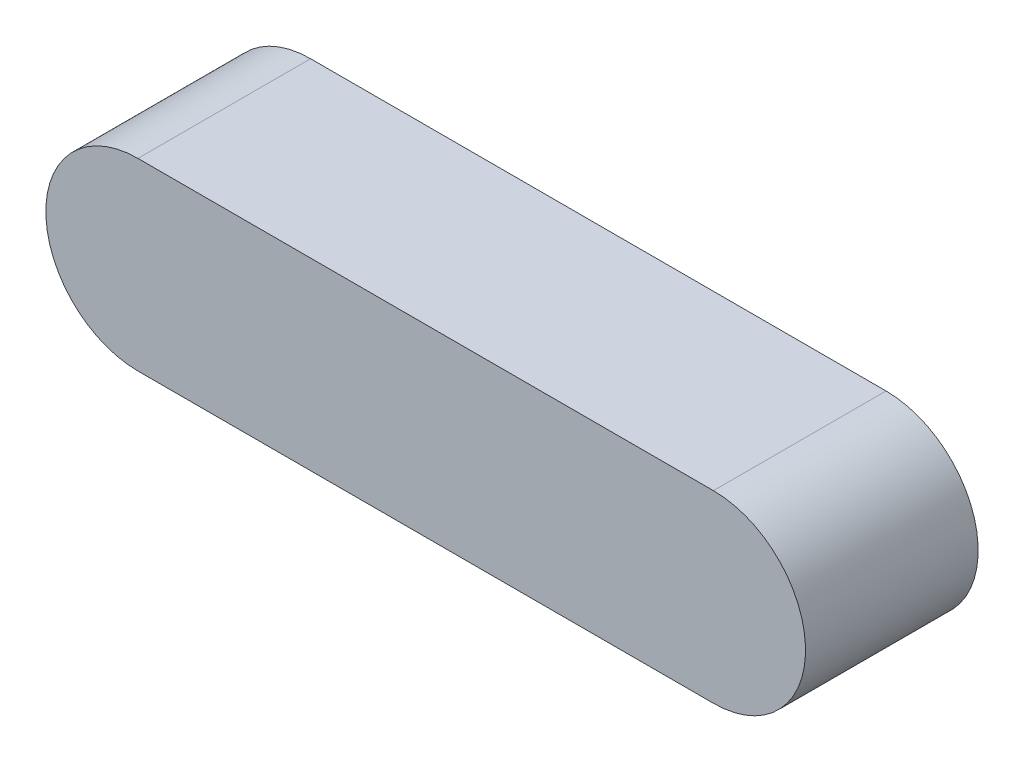
ISO-10303-21;
HEADER;
FILE_DESCRIPTION(('STEP AP214'),'2;1');
FILE_NAME('part.step','',(''),(''),'','','');
FILE_SCHEMA(('AUTOMOTIVE_DESIGN { 1 0 10303 214 1 1 1 1 }'));
ENDSEC;
DATA;
#1=APPLICATION_CONTEXT('core data for automotive mechanical design processes');
#2=APPLICATION_PROTOCOL_DEFINITION('international standard','automotive_design',2000,#1);
#3=PRODUCT_CONTEXT('',#1,'mechanical');
#4=PRODUCT('Part','Part','',(#3));
#5=PRODUCT_RELATED_PRODUCT_CATEGORY('part','',(#4));
#6=PRODUCT_DEFINITION_FORMATION('','',#4);
#7=PRODUCT_DEFINITION_CONTEXT('part definition',#1,'design');
#8=PRODUCT_DEFINITION('design','',#6,#7);
#9=PRODUCT_DEFINITION_SHAPE('','',#8);
#10=(LENGTH_UNIT() NAMED_UNIT(*) SI_UNIT(.MILLI.,.METRE.));
#11=(NAMED_UNIT(*) PLANE_ANGLE_UNIT() SI_UNIT($,.RADIAN.));
#12=(NAMED_UNIT(*) SI_UNIT($,.STERADIAN.) SOLID_ANGLE_UNIT());
#13=UNCERTAINTY_MEASURE_WITH_UNIT(LENGTH_MEASURE(1.E-05),#10,'distance_accuracy_value','');
#14=(GEOMETRIC_REPRESENTATION_CONTEXT(3) GLOBAL_UNCERTAINTY_ASSIGNED_CONTEXT((#13)) GLOBAL_UNIT_ASSIGNED_CONTEXT((#10,
#11,#12)) REPRESENTATION_CONTEXT('',''));
#15=CARTESIAN_POINT('',(0.,0.,0.));
#16=DIRECTION('',(0.,0.,1.));
#17=DIRECTION('',(1.,0.,0.));
#18=AXIS2_PLACEMENT_3D('',#15,#16,#17);
#19=CARTESIAN_POINT('',(-12.5,0.,7.5));
#20=DIRECTION('',(0.,0.,-1.));
#21=DIRECTION('',(-1.,0.,0.));
#22=AXIS2_PLACEMENT_3D('',#19,#20,#21);
#23=CYLINDRICAL_SURFACE('',#22,4.);
#24=CARTESIAN_POINT('',(-12.5,0.,0.));
#25=DIRECTION('',(0.,0.,1.));
#26=DIRECTION('',(1.,0.,0.));
#27=AXIS2_PLACEMENT_3D('',#24,#25,#26);
#28=CIRCLE('',#27,4.);
#29=CARTESIAN_POINT('',(-12.5,4.,0.));
#30=VERTEX_POINT('',#29);
#31=CARTESIAN_POINT('',(-12.5,-4.,0.));
#32=VERTEX_POINT('',#31);
#33=EDGE_CURVE('E96',#30,#32,#28,.T.);
#34=ORIENTED_EDGE('',*,*,#33,.T.);
#35=DIRECTION('',(0.,0.,-1.));
#36=VECTOR('',#35,1.);
#37=CARTESIAN_POINT('',(-12.5,-4.,7.5));
#38=LINE('',#37,#36);
#39=CARTESIAN_POINT('',(-12.5,-4.,7.5));
#40=VERTEX_POINT('',#39);
#41=EDGE_CURVE('E11',#40,#32,#38,.T.);
#42=ORIENTED_EDGE('',*,*,#41,.F.);
#43=CARTESIAN_POINT('',(-12.5,0.,7.5));
#44=DIRECTION('',(0.,0.,1.));
#45=DIRECTION('',(1.,0.,0.));
#46=AXIS2_PLACEMENT_3D('',#43,#44,#45);
#47=CIRCLE('',#46,4.);
#48=CARTESIAN_POINT('',(-12.5,4.,7.5));
#49=VERTEX_POINT('',#48);
#50=EDGE_CURVE('E84',#49,#40,#47,.T.);
#51=ORIENTED_EDGE('',*,*,#50,.F.);
#52=DIRECTION('',(0.,0.,-1.));
#53=VECTOR('',#52,1.);
#54=CARTESIAN_POINT('',(-12.5,4.,7.5));
#55=LINE('',#54,#53);
#56=EDGE_CURVE('E92',#49,#30,#55,.T.);
#57=ORIENTED_EDGE('',*,*,#56,.T.);
#58=EDGE_LOOP('',(#34,#42,#51,#57));
#59=FACE_BOUND('',#58,.T.);
#60=ADVANCED_FACE('F33',(#59),#23,.T.);
#61=CARTESIAN_POINT('',(-12.5,-4.,7.5));
#62=DIRECTION('',(0.,1.,0.));
#63=DIRECTION('',(0.,0.,1.));
#64=AXIS2_PLACEMENT_3D('',#61,#62,#63);
#65=PLANE('',#64);
#66=DIRECTION('',(1.,0.,0.));
#67=VECTOR('',#66,1.);
#68=CARTESIAN_POINT('',(-12.5,-4.,0.));
#69=LINE('',#68,#67);
#70=CARTESIAN_POINT('',(12.5,-4.,0.));
#71=VERTEX_POINT('',#70);
#72=EDGE_CURVE('E88',#32,#71,#69,.T.);
#73=ORIENTED_EDGE('',*,*,#72,.T.);
#74=DIRECTION('',(0.,0.,-1.));
#75=VECTOR('',#74,1.);
#76=CARTESIAN_POINT('',(12.5,-4.,7.5));
#77=LINE('',#76,#75);
#78=CARTESIAN_POINT('',(12.5,-4.,7.5));
#79=VERTEX_POINT('',#78);
#80=EDGE_CURVE('E41',#79,#71,#77,.T.);
#81=ORIENTED_EDGE('',*,*,#80,.F.);
#82=DIRECTION('',(1.,0.,0.));
#83=VECTOR('',#82,1.);
#84=CARTESIAN_POINT('',(-12.5,-4.,7.5));
#85=LINE('',#84,#83);
#86=EDGE_CURVE('E79',#40,#79,#85,.T.);
#87=ORIENTED_EDGE('',*,*,#86,.F.);
#88=ORIENTED_EDGE('',*,*,#41,.T.);
#89=EDGE_LOOP('',(#73,#81,#87,#88));
#90=FACE_BOUND('',#89,.T.);
#91=ADVANCED_FACE('F87',(#90),#65,.F.);
#92=CARTESIAN_POINT('',(12.5,0.,7.5));
#93=DIRECTION('',(0.,0.,-1.));
#94=DIRECTION('',(-1.,0.,0.));
#95=AXIS2_PLACEMENT_3D('',#92,#93,#94);
#96=CYLINDRICAL_SURFACE('',#95,4.);
#97=CARTESIAN_POINT('',(12.5,0.,0.));
#98=DIRECTION('',(0.,0.,1.));
#99=DIRECTION('',(1.,0.,0.));
#100=AXIS2_PLACEMENT_3D('',#97,#98,#99);
#101=CIRCLE('',#100,4.);
#102=CARTESIAN_POINT('',(12.5,4.,0.));
#103=VERTEX_POINT('',#102);
#104=EDGE_CURVE('E66',#71,#103,#101,.T.);
#105=ORIENTED_EDGE('',*,*,#104,.T.);
#106=DIRECTION('',(0.,0.,-1.));
#107=VECTOR('',#106,1.);
#108=CARTESIAN_POINT('',(12.5,4.,7.5));
#109=LINE('',#108,#107);
#110=CARTESIAN_POINT('',(12.5,4.,7.5));
#111=VERTEX_POINT('',#110);
#112=EDGE_CURVE('E89',#111,#103,#109,.T.);
#113=ORIENTED_EDGE('',*,*,#112,.F.);
#114=CARTESIAN_POINT('',(12.5,0.,7.5));
#115=DIRECTION('',(0.,0.,1.));
#116=DIRECTION('',(1.,0.,0.));
#117=AXIS2_PLACEMENT_3D('',#114,#115,#116);
#118=CIRCLE('',#117,4.);
#119=EDGE_CURVE('E82',#79,#111,#118,.T.);
#120=ORIENTED_EDGE('',*,*,#119,.F.);
#121=ORIENTED_EDGE('',*,*,#80,.T.);
#122=EDGE_LOOP('',(#105,#113,#120,#121));
#123=FACE_BOUND('',#122,.T.);
#124=ADVANCED_FACE('F90',(#123),#96,.T.);
#125=CARTESIAN_POINT('',(-12.5,4.,7.5));
#126=DIRECTION('',(0.,-1.,0.));
#127=DIRECTION('',(1.,0.,0.));
#128=AXIS2_PLACEMENT_3D('',#125,#126,#127);
#129=PLANE('',#128);
#130=DIRECTION('',(-1.,0.,0.));
#131=VECTOR('',#130,1.);
#132=CARTESIAN_POINT('',(-12.5,4.,0.));
#133=LINE('',#132,#131);
#134=EDGE_CURVE('E72',#103,#30,#133,.T.);
#135=ORIENTED_EDGE('',*,*,#134,.T.);
#136=ORIENTED_EDGE('',*,*,#56,.F.);
#137=DIRECTION('',(-1.,0.,0.));
#138=VECTOR('',#137,1.);
#139=CARTESIAN_POINT('',(-12.5,4.,7.5));
#140=LINE('',#139,#138);
#141=EDGE_CURVE('E49',#111,#49,#140,.T.);
#142=ORIENTED_EDGE('',*,*,#141,.F.);
#143=ORIENTED_EDGE('',*,*,#112,.T.);
#144=EDGE_LOOP('',(#135,#136,#142,#143));
#145=FACE_BOUND('',#144,.T.);
#146=ADVANCED_FACE('F103',(#145),#129,.F.);
#147=CARTESIAN_POINT('',(-12.5,0.,7.5));
#148=DIRECTION('',(0.,0.,1.));
#149=DIRECTION('',(1.,0.,0.));
#150=AXIS2_PLACEMENT_3D('',#147,#148,#149);
#151=PLANE('',#150);
#152=ORIENTED_EDGE('',*,*,#50,.T.);
#153=ORIENTED_EDGE('',*,*,#86,.T.);
#154=ORIENTED_EDGE('',*,*,#119,.T.);
#155=ORIENTED_EDGE('',*,*,#141,.T.);
#156=EDGE_LOOP('',(#152,#153,#154,#155));
#157=FACE_BOUND('',#156,.T.);
#158=ADVANCED_FACE('F80',(#157),#151,.T.);
#159=CARTESIAN_POINT('',(-12.5,0.,0.));
#160=DIRECTION('',(0.,0.,1.));
#161=DIRECTION('',(1.,0.,0.));
#162=AXIS2_PLACEMENT_3D('',#159,#160,#161);
#163=PLANE('',#162);
#164=ORIENTED_EDGE('',*,*,#33,.F.);
#165=ORIENTED_EDGE('',*,*,#134,.F.);
#166=ORIENTED_EDGE('',*,*,#104,.F.);
#167=ORIENTED_EDGE('',*,*,#72,.F.);
#168=EDGE_LOOP('',(#164,#165,#166,#167));
#169=FACE_BOUND('',#168,.T.);
#170=ADVANCED_FACE('F106',(#169),#163,.F.);
#171=CLOSED_SHELL('',(#60,#91,#124,#146,#158,#170));
#172=MANIFOLD_SOLID_BREP('B2',#171);
#173=ADVANCED_BREP_SHAPE_REPRESENTATION('',(#18,#172),#14);
#174=SHAPE_DEFINITION_REPRESENTATION(#9,#173);
ENDSEC;
END-ISO-10303-21;
